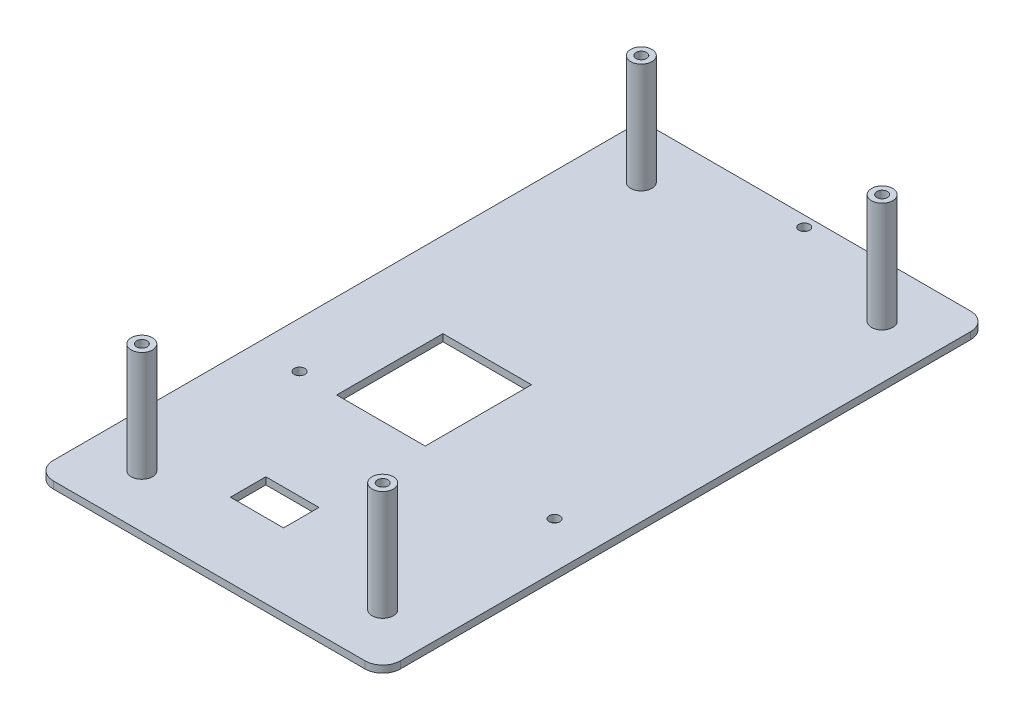
ISO-10303-21;
HEADER;
FILE_DESCRIPTION(('STEP AP214'),'2;1');
FILE_NAME('part.step','',(''),(''),'','','');
FILE_SCHEMA(('AUTOMOTIVE_DESIGN { 1 0 10303 214 1 1 1 1 }'));
ENDSEC;
DATA;
#1=APPLICATION_CONTEXT('core data for automotive mechanical design processes');
#2=APPLICATION_PROTOCOL_DEFINITION('international standard','automotive_design',2000,#1);
#3=PRODUCT_CONTEXT('',#1,'mechanical');
#4=PRODUCT('Part','Part','',(#3));
#5=PRODUCT_RELATED_PRODUCT_CATEGORY('part','',(#4));
#6=PRODUCT_DEFINITION_FORMATION('','',#4);
#7=PRODUCT_DEFINITION_CONTEXT('part definition',#1,'design');
#8=PRODUCT_DEFINITION('design','',#6,#7);
#9=PRODUCT_DEFINITION_SHAPE('','',#8);
#10=(LENGTH_UNIT() NAMED_UNIT(*) SI_UNIT(.MILLI.,.METRE.));
#11=(NAMED_UNIT(*) PLANE_ANGLE_UNIT() SI_UNIT($,.RADIAN.));
#12=(NAMED_UNIT(*) SI_UNIT($,.STERADIAN.) SOLID_ANGLE_UNIT());
#13=UNCERTAINTY_MEASURE_WITH_UNIT(LENGTH_MEASURE(1.E-05),#10,'distance_accuracy_value','');
#14=(GEOMETRIC_REPRESENTATION_CONTEXT(3) GLOBAL_UNCERTAINTY_ASSIGNED_CONTEXT((#13)) GLOBAL_UNIT_ASSIGNED_CONTEXT((#10,
#11,#12)) REPRESENTATION_CONTEXT('',''));
#15=CARTESIAN_POINT('',(0.,0.,0.));
#16=DIRECTION('',(0.,0.,1.));
#17=DIRECTION('',(1.,0.,0.));
#18=AXIS2_PLACEMENT_3D('',#15,#16,#17);
#19=CARTESIAN_POINT('',(0.,2.,64.5));
#20=DIRECTION('',(0.,0.,1.));
#21=DIRECTION('',(1.,0.,0.));
#22=AXIS2_PLACEMENT_3D('',#19,#20,#21);
#23=PLANE('',#22);
#24=DIRECTION('',(-1.,0.,0.));
#25=VECTOR('',#24,1.);
#26=CARTESIAN_POINT('',(0.,0.,64.5));
#27=LINE('',#26,#25);
#28=CARTESIAN_POINT('',(0.,0.,64.5));
#29=VERTEX_POINT('',#28);
#30=CARTESIAN_POINT('',(-15.,0.,64.5));
#31=VERTEX_POINT('',#30);
#32=EDGE_CURVE('E242',#29,#31,#27,.T.);
#33=ORIENTED_EDGE('',*,*,#32,.T.);
#34=DIRECTION('',(0.,-1.,0.));
#35=VECTOR('',#34,1.);
#36=CARTESIAN_POINT('',(-15.,2.,64.5));
#37=LINE('',#36,#35);
#38=CARTESIAN_POINT('',(-15.,2.,64.5));
#39=VERTEX_POINT('',#38);
#40=EDGE_CURVE('E267',#39,#31,#37,.T.);
#41=ORIENTED_EDGE('',*,*,#40,.F.);
#42=DIRECTION('',(-1.,0.,0.));
#43=VECTOR('',#42,1.);
#44=CARTESIAN_POINT('',(0.,2.,64.5));
#45=LINE('',#44,#43);
#46=CARTESIAN_POINT('',(0.,2.,64.5));
#47=VERTEX_POINT('',#46);
#48=EDGE_CURVE('E198',#47,#39,#45,.T.);
#49=ORIENTED_EDGE('',*,*,#48,.F.);
#50=DIRECTION('',(0.,-1.,0.));
#51=VECTOR('',#50,1.);
#52=CARTESIAN_POINT('',(0.,2.,64.5));
#53=LINE('',#52,#51);
#54=EDGE_CURVE('E170',#47,#29,#53,.T.);
#55=ORIENTED_EDGE('',*,*,#54,.T.);
#56=EDGE_LOOP('',(#33,#41,#49,#55));
#57=FACE_BOUND('',#56,.T.);
#58=ADVANCED_FACE('F41',(#57),#23,.F.);
#59=CARTESIAN_POINT('',(-15.,2.,0.));
#60=DIRECTION('',(-1.,0.,0.));
#61=DIRECTION('',(0.,0.,1.));
#62=AXIS2_PLACEMENT_3D('',#59,#60,#61);
#63=PLANE('',#62);
#64=DIRECTION('',(0.,0.,-1.));
#65=VECTOR('',#64,1.);
#66=CARTESIAN_POINT('',(-15.,0.,0.));
#67=LINE('',#66,#65);
#68=CARTESIAN_POINT('',(-15.,0.,54.5));
#69=VERTEX_POINT('',#68);
#70=EDGE_CURVE('E246',#31,#69,#67,.T.);
#71=ORIENTED_EDGE('',*,*,#70,.T.);
#72=DIRECTION('',(0.,-1.,0.));
#73=VECTOR('',#72,1.);
#74=CARTESIAN_POINT('',(-15.,2.,54.5));
#75=LINE('',#74,#73);
#76=CARTESIAN_POINT('',(-15.,2.,54.5));
#77=VERTEX_POINT('',#76);
#78=EDGE_CURVE('E264',#77,#69,#75,.T.);
#79=ORIENTED_EDGE('',*,*,#78,.F.);
#80=DIRECTION('',(0.,0.,-1.));
#81=VECTOR('',#80,1.);
#82=CARTESIAN_POINT('',(-15.,2.,0.));
#83=LINE('',#82,#81);
#84=EDGE_CURVE('E202',#39,#77,#83,.T.);
#85=ORIENTED_EDGE('',*,*,#84,.F.);
#86=ORIENTED_EDGE('',*,*,#40,.T.);
#87=EDGE_LOOP('',(#71,#79,#85,#86));
#88=FACE_BOUND('',#87,.T.);
#89=ADVANCED_FACE('F357',(#88),#63,.F.);
#90=CARTESIAN_POINT('',(0.,2.,54.5));
#91=DIRECTION('',(0.,0.,1.));
#92=DIRECTION('',(1.,0.,0.));
#93=AXIS2_PLACEMENT_3D('',#90,#91,#92);
#94=PLANE('',#93);
#95=DIRECTION('',(-1.,0.,0.));
#96=VECTOR('',#95,1.);
#97=CARTESIAN_POINT('',(0.,0.,54.5));
#98=LINE('',#97,#96);
#99=CARTESIAN_POINT('',(0.,0.,54.5));
#100=VERTEX_POINT('',#99);
#101=EDGE_CURVE('E250',#100,#69,#98,.T.);
#102=ORIENTED_EDGE('',*,*,#101,.F.);
#103=DIRECTION('',(0.,-1.,0.));
#104=VECTOR('',#103,1.);
#105=CARTESIAN_POINT('',(0.,2.,54.5));
#106=LINE('',#105,#104);
#107=CARTESIAN_POINT('',(0.,2.,54.5));
#108=VERTEX_POINT('',#107);
#109=EDGE_CURVE('E261',#108,#100,#106,.T.);
#110=ORIENTED_EDGE('',*,*,#109,.F.);
#111=DIRECTION('',(-1.,0.,0.));
#112=VECTOR('',#111,1.);
#113=CARTESIAN_POINT('',(0.,2.,54.5));
#114=LINE('',#113,#112);
#115=EDGE_CURVE('E205',#108,#77,#114,.T.);
#116=ORIENTED_EDGE('',*,*,#115,.T.);
#117=ORIENTED_EDGE('',*,*,#78,.T.);
#118=EDGE_LOOP('',(#102,#110,#116,#117));
#119=FACE_BOUND('',#118,.T.);
#120=ADVANCED_FACE('F363',(#119),#94,.T.);
#121=CARTESIAN_POINT('',(0.,2.,0.));
#122=DIRECTION('',(-1.,0.,0.));
#123=DIRECTION('',(0.,0.,1.));
#124=AXIS2_PLACEMENT_3D('',#121,#122,#123);
#125=PLANE('',#124);
#126=DIRECTION('',(0.,0.,-1.));
#127=VECTOR('',#126,1.);
#128=CARTESIAN_POINT('',(0.,0.,0.));
#129=LINE('',#128,#127);
#130=CARTESIAN_POINT('',(0.,0.,24.5));
#131=VERTEX_POINT('',#130);
#132=CARTESIAN_POINT('',(0.,0.,-5.50000000000001));
#133=VERTEX_POINT('',#132);
#134=EDGE_CURVE('E165',#131,#133,#129,.T.);
#135=ORIENTED_EDGE('',*,*,#134,.F.);
#136=DIRECTION('',(0.,-1.,0.));
#137=VECTOR('',#136,1.);
#138=CARTESIAN_POINT('',(0.,2.,24.5));
#139=LINE('',#138,#137);
#140=CARTESIAN_POINT('',(0.,2.,24.5));
#141=VERTEX_POINT('',#140);
#142=EDGE_CURVE('E158',#141,#131,#139,.T.);
#143=ORIENTED_EDGE('',*,*,#142,.F.);
#144=DIRECTION('',(0.,0.,-1.));
#145=VECTOR('',#144,1.);
#146=CARTESIAN_POINT('',(0.,2.,0.));
#147=LINE('',#146,#145);
#148=CARTESIAN_POINT('',(0.,2.,-5.50000000000001));
#149=VERTEX_POINT('',#148);
#150=EDGE_CURVE('E162',#141,#149,#147,.T.);
#151=ORIENTED_EDGE('',*,*,#150,.T.);
#152=DIRECTION('',(0.,-1.,0.));
#153=VECTOR('',#152,1.);
#154=CARTESIAN_POINT('',(0.,2.,-5.50000000000001));
#155=LINE('',#154,#153);
#156=EDGE_CURVE('E213',#149,#133,#155,.T.);
#157=ORIENTED_EDGE('',*,*,#156,.T.);
#158=EDGE_LOOP('',(#135,#143,#151,#157));
#159=FACE_BOUND('',#158,.T.);
#160=ADVANCED_FACE('F160',(#159),#125,.T.);
#161=CARTESIAN_POINT('',(0.,2.,24.5));
#162=DIRECTION('',(0.,0.,1.));
#163=DIRECTION('',(1.,0.,0.));
#164=AXIS2_PLACEMENT_3D('',#161,#162,#163);
#165=PLANE('',#164);
#166=DIRECTION('',(-1.,0.,0.));
#167=VECTOR('',#166,1.);
#168=CARTESIAN_POINT('',(0.,0.,24.5));
#169=LINE('',#168,#167);
#170=CARTESIAN_POINT('',(-25.,0.,24.5));
#171=VERTEX_POINT('',#170);
#172=EDGE_CURVE('E231',#131,#171,#169,.T.);
#173=ORIENTED_EDGE('',*,*,#172,.T.);
#174=DIRECTION('',(0.,-1.,0.));
#175=VECTOR('',#174,1.);
#176=CARTESIAN_POINT('',(-25.,2.,24.5));
#177=LINE('',#176,#175);
#178=CARTESIAN_POINT('',(-25.,2.,24.5));
#179=VERTEX_POINT('',#178);
#180=EDGE_CURVE('E171',#179,#171,#177,.T.);
#181=ORIENTED_EDGE('',*,*,#180,.F.);
#182=DIRECTION('',(-1.,0.,0.));
#183=VECTOR('',#182,1.);
#184=CARTESIAN_POINT('',(0.,2.,24.5));
#185=LINE('',#184,#183);
#186=EDGE_CURVE('E174',#141,#179,#185,.T.);
#187=ORIENTED_EDGE('',*,*,#186,.F.);
#188=ORIENTED_EDGE('',*,*,#142,.T.);
#189=EDGE_LOOP('',(#173,#181,#187,#188));
#190=FACE_BOUND('',#189,.T.);
#191=ADVANCED_FACE('F175',(#190),#165,.F.);
#192=CARTESIAN_POINT('',(-25.,2.,0.));
#193=DIRECTION('',(1.,0.,0.));
#194=DIRECTION('',(0.,0.,-1.));
#195=AXIS2_PLACEMENT_3D('',#192,#193,#194);
#196=PLANE('',#195);
#197=DIRECTION('',(0.,0.,1.));
#198=VECTOR('',#197,1.);
#199=CARTESIAN_POINT('',(-25.,0.,0.));
#200=LINE('',#199,#198);
#201=CARTESIAN_POINT('',(-25.,0.,-5.5));
#202=VERTEX_POINT('',#201);
#203=EDGE_CURVE('E234',#202,#171,#200,.T.);
#204=ORIENTED_EDGE('',*,*,#203,.F.);
#205=DIRECTION('',(0.,-1.,0.));
#206=VECTOR('',#205,1.);
#207=CARTESIAN_POINT('',(-25.,2.,-5.5));
#208=LINE('',#207,#206);
#209=CARTESIAN_POINT('',(-25.,2.,-5.5));
#210=VERTEX_POINT('',#209);
#211=EDGE_CURVE('E274',#210,#202,#208,.T.);
#212=ORIENTED_EDGE('',*,*,#211,.F.);
#213=DIRECTION('',(0.,0.,1.));
#214=VECTOR('',#213,1.);
#215=CARTESIAN_POINT('',(-25.,2.,0.));
#216=LINE('',#215,#214);
#217=EDGE_CURVE('E180',#210,#179,#216,.T.);
#218=ORIENTED_EDGE('',*,*,#217,.T.);
#219=ORIENTED_EDGE('',*,*,#180,.T.);
#220=EDGE_LOOP('',(#204,#212,#218,#219));
#221=FACE_BOUND('',#220,.T.);
#222=ADVANCED_FACE('F374',(#221),#196,.T.);
#223=CARTESIAN_POINT('',(49.,2.,0.));
#224=DIRECTION('',(1.,0.,0.));
#225=DIRECTION('',(0.,0.,-1.));
#226=AXIS2_PLACEMENT_3D('',#223,#224,#225);
#227=PLANE('',#226);
#228=DIRECTION('',(0.,0.,1.));
#229=VECTOR('',#228,1.);
#230=CARTESIAN_POINT('',(49.,0.,0.));
#231=LINE('',#230,#229);
#232=CARTESIAN_POINT('',(49.,0.,-80.5));
#233=VERTEX_POINT('',#232);
#234=CARTESIAN_POINT('',(49.,0.,80.5));
#235=VERTEX_POINT('',#234);
#236=EDGE_CURVE('E214',#233,#235,#231,.T.);
#237=ORIENTED_EDGE('',*,*,#236,.F.);
#238=DIRECTION('',(0.,-1.,0.));
#239=VECTOR('',#238,1.);
#240=CARTESIAN_POINT('',(49.,2.,-80.5));
#241=LINE('',#240,#239);
#242=CARTESIAN_POINT('',(49.,2.,-80.5));
#243=VERTEX_POINT('',#242);
#244=EDGE_CURVE('E301',#233,#243,#241,.F.);
#245=ORIENTED_EDGE('',*,*,#244,.T.);
#246=DIRECTION('',(0.,0.,1.));
#247=VECTOR('',#246,1.);
#248=CARTESIAN_POINT('',(49.,2.,0.));
#249=LINE('',#248,#247);
#250=CARTESIAN_POINT('',(49.,2.,80.5));
#251=VERTEX_POINT('',#250);
#252=EDGE_CURVE('E258',#243,#251,#249,.T.);
#253=ORIENTED_EDGE('',*,*,#252,.T.);
#254=DIRECTION('',(0.,-1.,0.));
#255=VECTOR('',#254,1.);
#256=CARTESIAN_POINT('',(49.,0.,80.5));
#257=LINE('',#256,#255);
#258=EDGE_CURVE('E297',#251,#235,#257,.T.);
#259=ORIENTED_EDGE('',*,*,#258,.T.);
#260=EDGE_LOOP('',(#237,#245,#253,#259));
#261=FACE_BOUND('',#260,.T.);
#262=ADVANCED_FACE('F377',(#261),#227,.T.);
#263=CARTESIAN_POINT('',(0.,2.,-85.5));
#264=DIRECTION('',(0.,0.,-1.));
#265=DIRECTION('',(-1.,0.,0.));
#266=AXIS2_PLACEMENT_3D('',#263,#264,#265);
#267=PLANE('',#266);
#268=DIRECTION('',(1.,0.,0.));
#269=VECTOR('',#268,1.);
#270=CARTESIAN_POINT('',(0.,2.,-85.5));
#271=LINE('',#270,#269);
#272=CARTESIAN_POINT('',(-44.,2.,-85.5));
#273=VERTEX_POINT('',#272);
#274=CARTESIAN_POINT('',(44.,2.,-85.5));
#275=VERTEX_POINT('',#274);
#276=EDGE_CURVE('E424',#273,#275,#271,.T.);
#277=ORIENTED_EDGE('',*,*,#276,.T.);
#278=DIRECTION('',(0.,-1.,0.));
#279=VECTOR('',#278,1.);
#280=CARTESIAN_POINT('',(44.,2.,-85.5));
#281=LINE('',#280,#279);
#282=CARTESIAN_POINT('',(44.,0.,-85.5));
#283=VERTEX_POINT('',#282);
#284=EDGE_CURVE('E281',#275,#283,#281,.T.);
#285=ORIENTED_EDGE('',*,*,#284,.T.);
#286=DIRECTION('',(1.,0.,0.));
#287=VECTOR('',#286,1.);
#288=CARTESIAN_POINT('',(0.,0.,-85.5));
#289=LINE('',#288,#287);
#290=CARTESIAN_POINT('',(-44.,0.,-85.5));
#291=VERTEX_POINT('',#290);
#292=EDGE_CURVE('E218',#291,#283,#289,.T.);
#293=ORIENTED_EDGE('',*,*,#292,.F.);
#294=DIRECTION('',(0.,-1.,0.));
#295=VECTOR('',#294,1.);
#296=CARTESIAN_POINT('',(-44.,2.,-85.5));
#297=LINE('',#296,#295);
#298=EDGE_CURVE('E271',#291,#273,#297,.F.);
#299=ORIENTED_EDGE('',*,*,#298,.T.);
#300=EDGE_LOOP('',(#277,#285,#293,#299));
#301=FACE_BOUND('',#300,.T.);
#302=ADVANCED_FACE('F388',(#301),#267,.T.);
#303=CARTESIAN_POINT('',(-49.,2.,0.));
#304=DIRECTION('',(1.,0.,0.));
#305=DIRECTION('',(0.,0.,-1.));
#306=AXIS2_PLACEMENT_3D('',#303,#304,#305);
#307=PLANE('',#306);
#308=DIRECTION('',(0.,0.,1.));
#309=VECTOR('',#308,1.);
#310=CARTESIAN_POINT('',(-49.,2.,0.));
#311=LINE('',#310,#309);
#312=CARTESIAN_POINT('',(-49.,2.,-80.5));
#313=VERTEX_POINT('',#312);
#314=CARTESIAN_POINT('',(-49.,2.,80.5));
#315=VERTEX_POINT('',#314);
#316=EDGE_CURVE('E190',#313,#315,#311,.T.);
#317=ORIENTED_EDGE('',*,*,#316,.F.);
#318=DIRECTION('',(0.,-1.,0.));
#319=VECTOR('',#318,1.);
#320=CARTESIAN_POINT('',(-49.,0.,-80.5));
#321=LINE('',#320,#319);
#322=CARTESIAN_POINT('',(-49.,0.,-80.5));
#323=VERTEX_POINT('',#322);
#324=EDGE_CURVE('E318',#313,#323,#321,.T.);
#325=ORIENTED_EDGE('',*,*,#324,.T.);
#326=DIRECTION('',(0.,0.,1.));
#327=VECTOR('',#326,1.);
#328=CARTESIAN_POINT('',(-49.,0.,0.));
#329=LINE('',#328,#327);
#330=CARTESIAN_POINT('',(-49.,0.,80.5));
#331=VERTEX_POINT('',#330);
#332=EDGE_CURVE('E222',#323,#331,#329,.T.);
#333=ORIENTED_EDGE('',*,*,#332,.T.);
#334=DIRECTION('',(0.,-1.,0.));
#335=VECTOR('',#334,1.);
#336=CARTESIAN_POINT('',(-49.,2.,80.5));
#337=LINE('',#336,#335);
#338=EDGE_CURVE('E315',#331,#315,#337,.F.);
#339=ORIENTED_EDGE('',*,*,#338,.T.);
#340=EDGE_LOOP('',(#317,#325,#333,#339));
#341=FACE_BOUND('',#340,.T.);
#342=ADVANCED_FACE('F372',(#341),#307,.F.);
#343=CARTESIAN_POINT('',(0.,2.,-5.50000000000001));
#344=DIRECTION('',(0.,0.,1.));
#345=DIRECTION('',(1.,0.,0.));
#346=AXIS2_PLACEMENT_3D('',#343,#344,#345);
#347=PLANE('',#346);
#348=DIRECTION('',(-1.,0.,0.));
#349=VECTOR('',#348,1.);
#350=CARTESIAN_POINT('',(0.,0.,-5.50000000000001));
#351=LINE('',#350,#349);
#352=EDGE_CURVE('E238',#133,#202,#351,.T.);
#353=ORIENTED_EDGE('',*,*,#352,.F.);
#354=ORIENTED_EDGE('',*,*,#156,.F.);
#355=DIRECTION('',(-1.,0.,0.));
#356=VECTOR('',#355,1.);
#357=CARTESIAN_POINT('',(0.,2.,-5.50000000000001));
#358=LINE('',#357,#356);
#359=EDGE_CURVE('E185',#149,#210,#358,.T.);
#360=ORIENTED_EDGE('',*,*,#359,.T.);
#361=ORIENTED_EDGE('',*,*,#211,.T.);
#362=EDGE_LOOP('',(#353,#354,#360,#361));
#363=FACE_BOUND('',#362,.T.);
#364=ADVANCED_FACE('F368',(#363),#347,.T.);
#365=CARTESIAN_POINT('',(0.,2.,85.5));
#366=DIRECTION('',(0.,0.,-1.));
#367=DIRECTION('',(-1.,0.,0.));
#368=AXIS2_PLACEMENT_3D('',#365,#366,#367);
#369=PLANE('',#368);
#370=DIRECTION('',(1.,0.,0.));
#371=VECTOR('',#370,1.);
#372=CARTESIAN_POINT('',(0.,2.,85.5));
#373=LINE('',#372,#371);
#374=CARTESIAN_POINT('',(-44.,2.,85.5));
#375=VERTEX_POINT('',#374);
#376=CARTESIAN_POINT('',(44.,2.,85.5));
#377=VERTEX_POINT('',#376);
#378=EDGE_CURVE('E187',#375,#377,#373,.T.);
#379=ORIENTED_EDGE('',*,*,#378,.F.);
#380=DIRECTION('',(0.,-1.,0.));
#381=VECTOR('',#380,1.);
#382=CARTESIAN_POINT('',(-44.,2.,85.5));
#383=LINE('',#382,#381);
#384=CARTESIAN_POINT('',(-44.,0.,85.5));
#385=VERTEX_POINT('',#384);
#386=EDGE_CURVE('E11',#375,#385,#383,.T.);
#387=ORIENTED_EDGE('',*,*,#386,.T.);
#388=DIRECTION('',(1.,0.,0.));
#389=VECTOR('',#388,1.);
#390=CARTESIAN_POINT('',(0.,0.,85.5));
#391=LINE('',#390,#389);
#392=CARTESIAN_POINT('',(44.,0.,85.5));
#393=VERTEX_POINT('',#392);
#394=EDGE_CURVE('E226',#385,#393,#391,.T.);
#395=ORIENTED_EDGE('',*,*,#394,.T.);
#396=DIRECTION('',(0.,-1.,0.));
#397=VECTOR('',#396,1.);
#398=CARTESIAN_POINT('',(44.,2.,85.5));
#399=LINE('',#398,#397);
#400=EDGE_CURVE('E51',#393,#377,#399,.F.);
#401=ORIENTED_EDGE('',*,*,#400,.T.);
#402=EDGE_LOOP('',(#379,#387,#395,#401));
#403=FACE_BOUND('',#402,.T.);
#404=ADVANCED_FACE('F371',(#403),#369,.F.);
#405=CARTESIAN_POINT('',(0.,2.,0.));
#406=DIRECTION('',(-1.,0.,0.));
#407=DIRECTION('',(0.,0.,1.));
#408=AXIS2_PLACEMENT_3D('',#405,#406,#407);
#409=PLANE('',#408);
#410=DIRECTION('',(0.,0.,-1.));
#411=VECTOR('',#410,1.);
#412=CARTESIAN_POINT('',(0.,0.,0.));
#413=LINE('',#412,#411);
#414=EDGE_CURVE('E254',#29,#100,#413,.T.);
#415=ORIENTED_EDGE('',*,*,#414,.F.);
#416=ORIENTED_EDGE('',*,*,#54,.F.);
#417=DIRECTION('',(0.,0.,-1.));
#418=VECTOR('',#417,1.);
#419=CARTESIAN_POINT('',(0.,2.,0.));
#420=LINE('',#419,#418);
#421=EDGE_CURVE('E209',#47,#108,#420,.T.);
#422=ORIENTED_EDGE('',*,*,#421,.T.);
#423=ORIENTED_EDGE('',*,*,#109,.T.);
#424=EDGE_LOOP('',(#415,#416,#422,#423));
#425=FACE_BOUND('',#424,.T.);
#426=ADVANCED_FACE('F385',(#425),#409,.T.);
#427=CARTESIAN_POINT('',(0.,2.,0.));
#428=DIRECTION('',(0.,1.,0.));
#429=DIRECTION('',(0.,0.,1.));
#430=AXIS2_PLACEMENT_3D('',#427,#428,#429);
#431=PLANE('',#430);
#432=CARTESIAN_POINT('',(-34.,2.,70.5));
#433=DIRECTION('',(0.,1.,0.));
#434=DIRECTION('',(0.,0.,-1.));
#435=AXIS2_PLACEMENT_3D('',#432,#433,#434);
#436=CIRCLE('',#435,3.);
#437=CARTESIAN_POINT('',(-34.,2.,67.5));
#438=VERTEX_POINT('',#437);
#439=EDGE_CURVE('E711',#438,#438,#436,.T.);
#440=ORIENTED_EDGE('',*,*,#439,.F.);
#441=EDGE_LOOP('',(#440));
#442=FACE_BOUND('',#441,.T.);
#443=CARTESIAN_POINT('',(34.,2.,70.5));
#444=DIRECTION('',(0.,1.,0.));
#445=DIRECTION('',(0.,0.,1.));
#446=AXIS2_PLACEMENT_3D('',#443,#444,#445);
#447=CIRCLE('',#446,3.);
#448=CARTESIAN_POINT('',(34.,2.,73.5));
#449=VERTEX_POINT('',#448);
#450=EDGE_CURVE('E728',#449,#449,#447,.T.);
#451=ORIENTED_EDGE('',*,*,#450,.F.);
#452=EDGE_LOOP('',(#451));
#453=FACE_BOUND('',#452,.T.);
#454=CARTESIAN_POINT('',(34.,2.,-70.5));
#455=DIRECTION('',(0.,1.,0.));
#456=DIRECTION('',(0.,0.,-1.));
#457=AXIS2_PLACEMENT_3D('',#454,#455,#456);
#458=CIRCLE('',#457,3.);
#459=CARTESIAN_POINT('',(34.,2.,-73.5));
#460=VERTEX_POINT('',#459);
#461=EDGE_CURVE('E734',#460,#460,#458,.T.);
#462=ORIENTED_EDGE('',*,*,#461,.F.);
#463=EDGE_LOOP('',(#462));
#464=FACE_BOUND('',#463,.T.);
#465=CARTESIAN_POINT('',(-34.,2.,-70.5));
#466=DIRECTION('',(0.,1.,0.));
#467=DIRECTION('',(0.,0.,1.));
#468=AXIS2_PLACEMENT_3D('',#465,#466,#467);
#469=CIRCLE('',#468,3.);
#470=CARTESIAN_POINT('',(-34.,2.,-67.5));
#471=VERTEX_POINT('',#470);
#472=EDGE_CURVE('E742',#471,#471,#469,.T.);
#473=ORIENTED_EDGE('',*,*,#472,.F.);
#474=EDGE_LOOP('',(#473));
#475=FACE_BOUND('',#474,.T.);
#476=CARTESIAN_POINT('',(36.,2.,24.));
#477=DIRECTION('',(0.,1.,0.));
#478=DIRECTION('',(0.,0.,1.));
#479=AXIS2_PLACEMENT_3D('',#476,#477,#478);
#480=CIRCLE('',#479,1.5);
#481=CARTESIAN_POINT('',(36.,2.,25.5));
#482=VERTEX_POINT('',#481);
#483=EDGE_CURVE('E328',#482,#482,#480,.T.);
#484=ORIENTED_EDGE('',*,*,#483,.F.);
#485=EDGE_LOOP('',(#484));
#486=FACE_BOUND('',#485,.T.);
#487=CARTESIAN_POINT('',(-36.,2.,24.));
#488=DIRECTION('',(0.,1.,0.));
#489=DIRECTION('',(0.,0.,1.));
#490=AXIS2_PLACEMENT_3D('',#487,#488,#489);
#491=CIRCLE('',#490,1.5);
#492=CARTESIAN_POINT('',(-36.,2.,25.5));
#493=VERTEX_POINT('',#492);
#494=EDGE_CURVE('E754',#493,#493,#491,.T.);
#495=ORIENTED_EDGE('',*,*,#494,.F.);
#496=EDGE_LOOP('',(#495));
#497=FACE_BOUND('',#496,.T.);
#498=CARTESIAN_POINT('',(0.,2.,-82.5));
#499=DIRECTION('',(0.,1.,0.));
#500=DIRECTION('',(0.,0.,1.));
#501=AXIS2_PLACEMENT_3D('',#498,#499,#500);
#502=CIRCLE('',#501,1.5);
#503=CARTESIAN_POINT('',(0.,2.,-81.));
#504=VERTEX_POINT('',#503);
#505=EDGE_CURVE('E430',#504,#504,#502,.T.);
#506=ORIENTED_EDGE('',*,*,#505,.F.);
#507=EDGE_LOOP('',(#506));
#508=FACE_BOUND('',#507,.T.);
#509=ORIENTED_EDGE('',*,*,#252,.F.);
#510=CARTESIAN_POINT('',(44.,2.,-80.5));
#511=DIRECTION('',(0.,1.,0.));
#512=DIRECTION('',(0.,0.,1.));
#513=AXIS2_PLACEMENT_3D('',#510,#511,#512);
#514=CIRCLE('',#513,5.);
#515=EDGE_CURVE('E312',#243,#275,#514,.T.);
#516=ORIENTED_EDGE('',*,*,#515,.T.);
#517=ORIENTED_EDGE('',*,*,#276,.F.);
#518=CARTESIAN_POINT('',(-44.,2.,-80.5));
#519=DIRECTION('',(0.,1.,0.));
#520=DIRECTION('',(0.,0.,1.));
#521=AXIS2_PLACEMENT_3D('',#518,#519,#520);
#522=CIRCLE('',#521,5.);
#523=EDGE_CURVE('E309',#273,#313,#522,.T.);
#524=ORIENTED_EDGE('',*,*,#523,.T.);
#525=ORIENTED_EDGE('',*,*,#316,.T.);
#526=CARTESIAN_POINT('',(-44.,2.,80.5));
#527=DIRECTION('',(0.,1.,0.));
#528=DIRECTION('',(0.,0.,1.));
#529=AXIS2_PLACEMENT_3D('',#526,#527,#528);
#530=CIRCLE('',#529,5.);
#531=EDGE_CURVE('E65',#315,#375,#530,.T.);
#532=ORIENTED_EDGE('',*,*,#531,.T.);
#533=ORIENTED_EDGE('',*,*,#378,.T.);
#534=CARTESIAN_POINT('',(44.,2.,80.5));
#535=DIRECTION('',(0.,1.,0.));
#536=DIRECTION('',(0.,0.,1.));
#537=AXIS2_PLACEMENT_3D('',#534,#535,#536);
#538=CIRCLE('',#537,5.);
#539=EDGE_CURVE('E304',#377,#251,#538,.T.);
#540=ORIENTED_EDGE('',*,*,#539,.T.);
#541=EDGE_LOOP('',(#509,#516,#517,#524,#525,#532,#533,#540));
#542=FACE_BOUND('',#541,.T.);
#543=ORIENTED_EDGE('',*,*,#150,.F.);
#544=ORIENTED_EDGE('',*,*,#186,.T.);
#545=ORIENTED_EDGE('',*,*,#217,.F.);
#546=ORIENTED_EDGE('',*,*,#359,.F.);
#547=EDGE_LOOP('',(#543,#544,#545,#546));
#548=FACE_BOUND('',#547,.T.);
#549=ORIENTED_EDGE('',*,*,#48,.T.);
#550=ORIENTED_EDGE('',*,*,#84,.T.);
#551=ORIENTED_EDGE('',*,*,#115,.F.);
#552=ORIENTED_EDGE('',*,*,#421,.F.);
#553=EDGE_LOOP('',(#549,#550,#551,#552));
#554=FACE_BOUND('',#553,.T.);
#555=ADVANCED_FACE('F182',(#442,#453,#464,#475,#486,#497,#508,#542,#548,#554),#431,.T.);
#556=CARTESIAN_POINT('',(0.,0.,0.));
#557=DIRECTION('',(0.,1.,0.));
#558=DIRECTION('',(0.,0.,1.));
#559=AXIS2_PLACEMENT_3D('',#556,#557,#558);
#560=PLANE('',#559);
#561=CARTESIAN_POINT('',(36.,0.,24.));
#562=DIRECTION('',(0.,1.,0.));
#563=DIRECTION('',(0.,0.,1.));
#564=AXIS2_PLACEMENT_3D('',#561,#562,#563);
#565=CIRCLE('',#564,1.5);
#566=CARTESIAN_POINT('',(36.,0.,25.5));
#567=VERTEX_POINT('',#566);
#568=EDGE_CURVE('E45',#567,#567,#565,.T.);
#569=ORIENTED_EDGE('',*,*,#568,.T.);
#570=EDGE_LOOP('',(#569));
#571=FACE_BOUND('',#570,.T.);
#572=CARTESIAN_POINT('',(-36.,0.,24.));
#573=DIRECTION('',(0.,1.,0.));
#574=DIRECTION('',(0.,0.,1.));
#575=AXIS2_PLACEMENT_3D('',#572,#573,#574);
#576=CIRCLE('',#575,1.5);
#577=CARTESIAN_POINT('',(-36.,0.,25.5));
#578=VERTEX_POINT('',#577);
#579=EDGE_CURVE('E327',#578,#578,#576,.T.);
#580=ORIENTED_EDGE('',*,*,#579,.T.);
#581=EDGE_LOOP('',(#580));
#582=FACE_BOUND('',#581,.T.);
#583=CARTESIAN_POINT('',(0.,0.,-82.5));
#584=DIRECTION('',(0.,1.,0.));
#585=DIRECTION('',(0.,0.,1.));
#586=AXIS2_PLACEMENT_3D('',#583,#584,#585);
#587=CIRCLE('',#586,1.5);
#588=CARTESIAN_POINT('',(0.,0.,-81.));
#589=VERTEX_POINT('',#588);
#590=EDGE_CURVE('E324',#589,#589,#587,.T.);
#591=ORIENTED_EDGE('',*,*,#590,.T.);
#592=EDGE_LOOP('',(#591));
#593=FACE_BOUND('',#592,.T.);
#594=ORIENTED_EDGE('',*,*,#292,.T.);
#595=CARTESIAN_POINT('',(44.,0.,-80.5));
#596=DIRECTION('',(0.,1.,0.));
#597=DIRECTION('',(0.,0.,1.));
#598=AXIS2_PLACEMENT_3D('',#595,#596,#597);
#599=CIRCLE('',#598,5.);
#600=EDGE_CURVE('E294',#283,#233,#599,.F.);
#601=ORIENTED_EDGE('',*,*,#600,.T.);
#602=ORIENTED_EDGE('',*,*,#236,.T.);
#603=CARTESIAN_POINT('',(44.,0.,80.5));
#604=DIRECTION('',(0.,1.,0.));
#605=DIRECTION('',(0.,0.,1.));
#606=AXIS2_PLACEMENT_3D('',#603,#604,#605);
#607=CIRCLE('',#606,5.);
#608=EDGE_CURVE('E285',#235,#393,#607,.F.);
#609=ORIENTED_EDGE('',*,*,#608,.T.);
#610=ORIENTED_EDGE('',*,*,#394,.F.);
#611=CARTESIAN_POINT('',(-44.,0.,80.5));
#612=DIRECTION('',(0.,1.,0.));
#613=DIRECTION('',(0.,0.,1.));
#614=AXIS2_PLACEMENT_3D('',#611,#612,#613);
#615=CIRCLE('',#614,5.);
#616=EDGE_CURVE('E288',#385,#331,#615,.F.);
#617=ORIENTED_EDGE('',*,*,#616,.T.);
#618=ORIENTED_EDGE('',*,*,#332,.F.);
#619=CARTESIAN_POINT('',(-44.,0.,-80.5));
#620=DIRECTION('',(0.,1.,0.));
#621=DIRECTION('',(0.,0.,1.));
#622=AXIS2_PLACEMENT_3D('',#619,#620,#621);
#623=CIRCLE('',#622,5.);
#624=EDGE_CURVE('E291',#323,#291,#623,.F.);
#625=ORIENTED_EDGE('',*,*,#624,.T.);
#626=EDGE_LOOP('',(#594,#601,#602,#609,#610,#617,#618,#625));
#627=FACE_BOUND('',#626,.T.);
#628=ORIENTED_EDGE('',*,*,#134,.T.);
#629=ORIENTED_EDGE('',*,*,#352,.T.);
#630=ORIENTED_EDGE('',*,*,#203,.T.);
#631=ORIENTED_EDGE('',*,*,#172,.F.);
#632=EDGE_LOOP('',(#628,#629,#630,#631));
#633=FACE_BOUND('',#632,.T.);
#634=ORIENTED_EDGE('',*,*,#32,.F.);
#635=ORIENTED_EDGE('',*,*,#414,.T.);
#636=ORIENTED_EDGE('',*,*,#101,.T.);
#637=ORIENTED_EDGE('',*,*,#70,.F.);
#638=EDGE_LOOP('',(#634,#635,#636,#637));
#639=FACE_BOUND('',#638,.T.);
#640=ADVANCED_FACE('F337',(#571,#582,#593,#627,#633,#639),#560,.F.);
#641=CARTESIAN_POINT('',(44.,2.,-80.5));
#642=DIRECTION('',(0.,-1.,0.));
#643=DIRECTION('',(0.,0.,-1.));
#644=AXIS2_PLACEMENT_3D('',#641,#642,#643);
#645=CYLINDRICAL_SURFACE('',#644,5.);
#646=ORIENTED_EDGE('',*,*,#515,.F.);
#647=ORIENTED_EDGE('',*,*,#244,.F.);
#648=ORIENTED_EDGE('',*,*,#600,.F.);
#649=ORIENTED_EDGE('',*,*,#284,.F.);
#650=EDGE_LOOP('',(#646,#647,#648,#649));
#651=FACE_BOUND('',#650,.T.);
#652=ADVANCED_FACE('F396',(#651),#645,.T.);
#653=CARTESIAN_POINT('',(-44.,2.,-80.5));
#654=DIRECTION('',(0.,1.,0.));
#655=DIRECTION('',(0.,0.,1.));
#656=AXIS2_PLACEMENT_3D('',#653,#654,#655);
#657=CYLINDRICAL_SURFACE('',#656,5.);
#658=ORIENTED_EDGE('',*,*,#523,.F.);
#659=ORIENTED_EDGE('',*,*,#298,.F.);
#660=ORIENTED_EDGE('',*,*,#624,.F.);
#661=ORIENTED_EDGE('',*,*,#324,.F.);
#662=EDGE_LOOP('',(#658,#659,#660,#661));
#663=FACE_BOUND('',#662,.T.);
#664=ADVANCED_FACE('F399',(#663),#657,.T.);
#665=CARTESIAN_POINT('',(-44.,2.,80.5));
#666=DIRECTION('',(0.,-1.,0.));
#667=DIRECTION('',(0.,0.,-1.));
#668=AXIS2_PLACEMENT_3D('',#665,#666,#667);
#669=CYLINDRICAL_SURFACE('',#668,5.);
#670=ORIENTED_EDGE('',*,*,#531,.F.);
#671=ORIENTED_EDGE('',*,*,#338,.F.);
#672=ORIENTED_EDGE('',*,*,#616,.F.);
#673=ORIENTED_EDGE('',*,*,#386,.F.);
#674=EDGE_LOOP('',(#670,#671,#672,#673));
#675=FACE_BOUND('',#674,.T.);
#676=ADVANCED_FACE('F402',(#675),#669,.T.);
#677=CARTESIAN_POINT('',(44.,2.,80.5));
#678=DIRECTION('',(0.,1.,0.));
#679=DIRECTION('',(0.,0.,1.));
#680=AXIS2_PLACEMENT_3D('',#677,#678,#679);
#681=CYLINDRICAL_SURFACE('',#680,5.);
#682=ORIENTED_EDGE('',*,*,#539,.F.);
#683=ORIENTED_EDGE('',*,*,#400,.F.);
#684=ORIENTED_EDGE('',*,*,#608,.F.);
#685=ORIENTED_EDGE('',*,*,#258,.F.);
#686=EDGE_LOOP('',(#682,#683,#684,#685));
#687=FACE_BOUND('',#686,.T.);
#688=ADVANCED_FACE('F43',(#687),#681,.T.);
#689=CARTESIAN_POINT('',(0.,-8.,-82.5));
#690=DIRECTION('',(0.,1.,0.));
#691=DIRECTION('',(0.,0.,1.));
#692=AXIS2_PLACEMENT_3D('',#689,#690,#691);
#693=CYLINDRICAL_SURFACE('',#692,1.5);
#694=ORIENTED_EDGE('',*,*,#505,.T.);
#695=EDGE_LOOP('',(#694));
#696=FACE_BOUND('',#695,.T.);
#697=ORIENTED_EDGE('',*,*,#590,.F.);
#698=EDGE_LOOP('',(#697));
#699=FACE_BOUND('',#698,.T.);
#700=ADVANCED_FACE('F352',(#696,#699),#693,.F.);
#701=CARTESIAN_POINT('',(-36.,-8.,24.));
#702=DIRECTION('',(0.,1.,0.));
#703=DIRECTION('',(0.,0.,1.));
#704=AXIS2_PLACEMENT_3D('',#701,#702,#703);
#705=CYLINDRICAL_SURFACE('',#704,1.5);
#706=ORIENTED_EDGE('',*,*,#494,.T.);
#707=EDGE_LOOP('',(#706));
#708=FACE_BOUND('',#707,.T.);
#709=ORIENTED_EDGE('',*,*,#579,.F.);
#710=EDGE_LOOP('',(#709));
#711=FACE_BOUND('',#710,.T.);
#712=ADVANCED_FACE('F342',(#708,#711),#705,.F.);
#713=CARTESIAN_POINT('',(36.,-8.,24.));
#714=DIRECTION('',(0.,1.,0.));
#715=DIRECTION('',(0.,0.,1.));
#716=AXIS2_PLACEMENT_3D('',#713,#714,#715);
#717=CYLINDRICAL_SURFACE('',#716,1.5);
#718=ORIENTED_EDGE('',*,*,#483,.T.);
#719=EDGE_LOOP('',(#718));
#720=FACE_BOUND('',#719,.T.);
#721=ORIENTED_EDGE('',*,*,#568,.F.);
#722=EDGE_LOOP('',(#721));
#723=FACE_BOUND('',#722,.T.);
#724=ADVANCED_FACE('F339',(#720,#723),#717,.F.);
#725=CARTESIAN_POINT('',(-34.,33.,-70.5));
#726=DIRECTION('',(0.,-1.,0.));
#727=DIRECTION('',(0.,0.,-1.));
#728=AXIS2_PLACEMENT_3D('',#725,#726,#727);
#729=CYLINDRICAL_SURFACE('',#728,3.);
#730=CARTESIAN_POINT('',(-34.,33.,-70.5));
#731=DIRECTION('',(0.,1.,0.));
#732=DIRECTION('',(0.,0.,1.));
#733=AXIS2_PLACEMENT_3D('',#730,#731,#732);
#734=CIRCLE('',#733,3.);
#735=CARTESIAN_POINT('',(-34.,33.,-67.5));
#736=VERTEX_POINT('',#735);
#737=EDGE_CURVE('E746',#736,#736,#734,.T.);
#738=ORIENTED_EDGE('',*,*,#737,.F.);
#739=EDGE_LOOP('',(#738));
#740=FACE_BOUND('',#739,.T.);
#741=ORIENTED_EDGE('',*,*,#472,.T.);
#742=EDGE_LOOP('',(#741));
#743=FACE_BOUND('',#742,.T.);
#744=ADVANCED_FACE('F341',(#740,#743),#729,.T.);
#745=CARTESIAN_POINT('',(-34.,33.,-70.5));
#746=DIRECTION('',(0.,1.,0.));
#747=DIRECTION('',(0.,0.,1.));
#748=AXIS2_PLACEMENT_3D('',#745,#746,#747);
#749=PLANE('',#748);
#750=CARTESIAN_POINT('',(-34.,33.,-70.5));
#751=DIRECTION('',(0.,1.,0.));
#752=DIRECTION('',(0.,0.,1.));
#753=AXIS2_PLACEMENT_3D('',#750,#751,#752);
#754=CIRCLE('',#753,1.5);
#755=CARTESIAN_POINT('',(-34.,33.,-69.));
#756=VERTEX_POINT('',#755);
#757=EDGE_CURVE('E712',#756,#756,#754,.T.);
#758=ORIENTED_EDGE('',*,*,#757,.F.);
#759=EDGE_LOOP('',(#758));
#760=FACE_BOUND('',#759,.T.);
#761=ORIENTED_EDGE('',*,*,#737,.T.);
#762=EDGE_LOOP('',(#761));
#763=FACE_BOUND('',#762,.T.);
#764=ADVANCED_FACE('F349',(#760,#763),#749,.T.);
#765=CARTESIAN_POINT('',(34.,33.,-70.5));
#766=DIRECTION('',(0.,-1.,0.));
#767=DIRECTION('',(0.,0.,-1.));
#768=AXIS2_PLACEMENT_3D('',#765,#766,#767);
#769=CYLINDRICAL_SURFACE('',#768,3.);
#770=CARTESIAN_POINT('',(34.,33.,-70.5));
#771=DIRECTION('',(0.,1.,0.));
#772=DIRECTION('',(0.,0.,-1.));
#773=AXIS2_PLACEMENT_3D('',#770,#771,#772);
#774=CIRCLE('',#773,3.);
#775=CARTESIAN_POINT('',(34.,33.,-73.5));
#776=VERTEX_POINT('',#775);
#777=EDGE_CURVE('E738',#776,#776,#774,.T.);
#778=ORIENTED_EDGE('',*,*,#777,.F.);
#779=EDGE_LOOP('',(#778));
#780=FACE_BOUND('',#779,.T.);
#781=ORIENTED_EDGE('',*,*,#461,.T.);
#782=EDGE_LOOP('',(#781));
#783=FACE_BOUND('',#782,.T.);
#784=ADVANCED_FACE('F564',(#780,#783),#769,.T.);
#785=CARTESIAN_POINT('',(34.,33.,-70.5));
#786=DIRECTION('',(0.,-1.,0.));
#787=DIRECTION('',(0.,0.,-1.));
#788=AXIS2_PLACEMENT_3D('',#785,#786,#787);
#789=PLANE('',#788);
#790=CARTESIAN_POINT('',(34.,33.,-70.5));
#791=DIRECTION('',(0.,1.,0.));
#792=DIRECTION('',(0.,0.,1.));
#793=AXIS2_PLACEMENT_3D('',#790,#791,#792);
#794=CIRCLE('',#793,1.5);
#795=CARTESIAN_POINT('',(34.,33.,-69.));
#796=VERTEX_POINT('',#795);
#797=EDGE_CURVE('E793',#796,#796,#794,.T.);
#798=ORIENTED_EDGE('',*,*,#797,.F.);
#799=EDGE_LOOP('',(#798));
#800=FACE_BOUND('',#799,.T.);
#801=ORIENTED_EDGE('',*,*,#777,.T.);
#802=EDGE_LOOP('',(#801));
#803=FACE_BOUND('',#802,.T.);
#804=ADVANCED_FACE('F574',(#800,#803),#789,.F.);
#805=CARTESIAN_POINT('',(34.,33.,70.5));
#806=DIRECTION('',(0.,-1.,0.));
#807=DIRECTION('',(0.,0.,-1.));
#808=AXIS2_PLACEMENT_3D('',#805,#806,#807);
#809=CYLINDRICAL_SURFACE('',#808,3.);
#810=CARTESIAN_POINT('',(34.,33.,70.5));
#811=DIRECTION('',(0.,1.,0.));
#812=DIRECTION('',(0.,0.,1.));
#813=AXIS2_PLACEMENT_3D('',#810,#811,#812);
#814=CIRCLE('',#813,3.);
#815=CARTESIAN_POINT('',(34.,33.,73.5));
#816=VERTEX_POINT('',#815);
#817=EDGE_CURVE('E730',#816,#816,#814,.T.);
#818=ORIENTED_EDGE('',*,*,#817,.F.);
#819=EDGE_LOOP('',(#818));
#820=FACE_BOUND('',#819,.T.);
#821=ORIENTED_EDGE('',*,*,#450,.T.);
#822=EDGE_LOOP('',(#821));
#823=FACE_BOUND('',#822,.T.);
#824=ADVANCED_FACE('F583',(#820,#823),#809,.T.);
#825=CARTESIAN_POINT('',(34.,33.,70.5));
#826=DIRECTION('',(0.,1.,0.));
#827=DIRECTION('',(0.,0.,1.));
#828=AXIS2_PLACEMENT_3D('',#825,#826,#827);
#829=PLANE('',#828);
#830=CARTESIAN_POINT('',(34.,33.,70.5));
#831=DIRECTION('',(0.,1.,0.));
#832=DIRECTION('',(0.,0.,1.));
#833=AXIS2_PLACEMENT_3D('',#830,#831,#832);
#834=CIRCLE('',#833,1.5);
#835=CARTESIAN_POINT('',(34.,33.,72.));
#836=VERTEX_POINT('',#835);
#837=EDGE_CURVE('E800',#836,#836,#834,.T.);
#838=ORIENTED_EDGE('',*,*,#837,.F.);
#839=EDGE_LOOP('',(#838));
#840=FACE_BOUND('',#839,.T.);
#841=ORIENTED_EDGE('',*,*,#817,.T.);
#842=EDGE_LOOP('',(#841));
#843=FACE_BOUND('',#842,.T.);
#844=ADVANCED_FACE('F592',(#840,#843),#829,.T.);
#845=CARTESIAN_POINT('',(-34.,33.,70.5));
#846=DIRECTION('',(0.,-1.,0.));
#847=DIRECTION('',(0.,0.,-1.));
#848=AXIS2_PLACEMENT_3D('',#845,#846,#847);
#849=CYLINDRICAL_SURFACE('',#848,3.);
#850=CARTESIAN_POINT('',(-34.,33.,70.5));
#851=DIRECTION('',(0.,1.,0.));
#852=DIRECTION('',(0.,0.,-1.));
#853=AXIS2_PLACEMENT_3D('',#850,#851,#852);
#854=CIRCLE('',#853,3.);
#855=CARTESIAN_POINT('',(-34.,33.,67.5));
#856=VERTEX_POINT('',#855);
#857=EDGE_CURVE('E717',#856,#856,#854,.T.);
#858=ORIENTED_EDGE('',*,*,#857,.F.);
#859=EDGE_LOOP('',(#858));
#860=FACE_BOUND('',#859,.T.);
#861=ORIENTED_EDGE('',*,*,#439,.T.);
#862=EDGE_LOOP('',(#861));
#863=FACE_BOUND('',#862,.T.);
#864=ADVANCED_FACE('F600',(#860,#863),#849,.T.);
#865=CARTESIAN_POINT('',(-34.,33.,70.5));
#866=DIRECTION('',(0.,-1.,0.));
#867=DIRECTION('',(0.,0.,-1.));
#868=AXIS2_PLACEMENT_3D('',#865,#866,#867);
#869=PLANE('',#868);
#870=CARTESIAN_POINT('',(-34.,33.,70.5));
#871=DIRECTION('',(0.,1.,0.));
#872=DIRECTION('',(0.,0.,1.));
#873=AXIS2_PLACEMENT_3D('',#870,#871,#872);
#874=CIRCLE('',#873,1.5);
#875=CARTESIAN_POINT('',(-34.,33.,72.));
#876=VERTEX_POINT('',#875);
#877=EDGE_CURVE('E723',#876,#876,#874,.T.);
#878=ORIENTED_EDGE('',*,*,#877,.F.);
#879=EDGE_LOOP('',(#878));
#880=FACE_BOUND('',#879,.T.);
#881=ORIENTED_EDGE('',*,*,#857,.T.);
#882=EDGE_LOOP('',(#881));
#883=FACE_BOUND('',#882,.T.);
#884=ADVANCED_FACE('F609',(#880,#883),#869,.F.);
#885=CARTESIAN_POINT('',(-34.,18.,70.5));
#886=DIRECTION('',(0.,1.,0.));
#887=DIRECTION('',(0.,0.,1.));
#888=AXIS2_PLACEMENT_3D('',#885,#886,#887);
#889=CYLINDRICAL_SURFACE('',#888,1.5);
#890=CARTESIAN_POINT('',(-34.,18.,70.5));
#891=DIRECTION('',(0.,1.,0.));
#892=DIRECTION('',(0.,0.,1.));
#893=AXIS2_PLACEMENT_3D('',#890,#891,#892);
#894=CIRCLE('',#893,1.5);
#895=CARTESIAN_POINT('',(-34.,18.,72.));
#896=VERTEX_POINT('',#895);
#897=EDGE_CURVE('E788',#896,#896,#894,.T.);
#898=ORIENTED_EDGE('',*,*,#897,.F.);
#899=EDGE_LOOP('',(#898));
#900=FACE_BOUND('',#899,.T.);
#901=ORIENTED_EDGE('',*,*,#877,.T.);
#902=EDGE_LOOP('',(#901));
#903=FACE_BOUND('',#902,.T.);
#904=ADVANCED_FACE('F617',(#900,#903),#889,.F.);
#905=CARTESIAN_POINT('',(-34.,18.,70.5));
#906=DIRECTION('',(0.,1.,0.));
#907=DIRECTION('',(0.,0.,1.));
#908=AXIS2_PLACEMENT_3D('',#905,#906,#907);
#909=PLANE('',#908);
#910=ORIENTED_EDGE('',*,*,#897,.T.);
#911=EDGE_LOOP('',(#910));
#912=FACE_BOUND('',#911,.T.);
#913=ADVANCED_FACE('F626',(#912),#909,.T.);
#914=CARTESIAN_POINT('',(34.,18.,70.5));
#915=DIRECTION('',(0.,1.,0.));
#916=DIRECTION('',(0.,0.,1.));
#917=AXIS2_PLACEMENT_3D('',#914,#915,#916);
#918=CYLINDRICAL_SURFACE('',#917,1.5);
#919=CARTESIAN_POINT('',(34.,18.,70.5));
#920=DIRECTION('',(0.,1.,0.));
#921=DIRECTION('',(0.,0.,1.));
#922=AXIS2_PLACEMENT_3D('',#919,#920,#921);
#923=CIRCLE('',#922,1.5);
#924=CARTESIAN_POINT('',(34.,18.,72.));
#925=VERTEX_POINT('',#924);
#926=EDGE_CURVE('E789',#925,#925,#923,.T.);
#927=ORIENTED_EDGE('',*,*,#926,.F.);
#928=EDGE_LOOP('',(#927));
#929=FACE_BOUND('',#928,.T.);
#930=ORIENTED_EDGE('',*,*,#837,.T.);
#931=EDGE_LOOP('',(#930));
#932=FACE_BOUND('',#931,.T.);
#933=ADVANCED_FACE('F635',(#929,#932),#918,.F.);
#934=CARTESIAN_POINT('',(34.,18.,70.5));
#935=DIRECTION('',(0.,1.,0.));
#936=DIRECTION('',(0.,0.,1.));
#937=AXIS2_PLACEMENT_3D('',#934,#935,#936);
#938=PLANE('',#937);
#939=ORIENTED_EDGE('',*,*,#926,.T.);
#940=EDGE_LOOP('',(#939));
#941=FACE_BOUND('',#940,.T.);
#942=ADVANCED_FACE('F644',(#941),#938,.T.);
#943=CARTESIAN_POINT('',(34.,18.,-70.5));
#944=DIRECTION('',(0.,1.,0.));
#945=DIRECTION('',(0.,0.,1.));
#946=AXIS2_PLACEMENT_3D('',#943,#944,#945);
#947=CYLINDRICAL_SURFACE('',#946,1.5);
#948=CARTESIAN_POINT('',(34.,18.,-70.5));
#949=DIRECTION('',(0.,1.,0.));
#950=DIRECTION('',(0.,0.,1.));
#951=AXIS2_PLACEMENT_3D('',#948,#949,#950);
#952=CIRCLE('',#951,1.5);
#953=CARTESIAN_POINT('',(34.,18.,-69.));
#954=VERTEX_POINT('',#953);
#955=EDGE_CURVE('E720',#954,#954,#952,.T.);
#956=ORIENTED_EDGE('',*,*,#955,.F.);
#957=EDGE_LOOP('',(#956));
#958=FACE_BOUND('',#957,.T.);
#959=ORIENTED_EDGE('',*,*,#797,.T.);
#960=EDGE_LOOP('',(#959));
#961=FACE_BOUND('',#960,.T.);
#962=ADVANCED_FACE('F653',(#958,#961),#947,.F.);
#963=CARTESIAN_POINT('',(34.,18.,-70.5));
#964=DIRECTION('',(0.,1.,0.));
#965=DIRECTION('',(0.,0.,1.));
#966=AXIS2_PLACEMENT_3D('',#963,#964,#965);
#967=PLANE('',#966);
#968=ORIENTED_EDGE('',*,*,#955,.T.);
#969=EDGE_LOOP('',(#968));
#970=FACE_BOUND('',#969,.T.);
#971=ADVANCED_FACE('F662',(#970),#967,.T.);
#972=CARTESIAN_POINT('',(-34.,18.,-70.5));
#973=DIRECTION('',(0.,1.,0.));
#974=DIRECTION('',(0.,0.,1.));
#975=AXIS2_PLACEMENT_3D('',#972,#973,#974);
#976=CYLINDRICAL_SURFACE('',#975,1.5);
#977=CARTESIAN_POINT('',(-34.,18.,-70.5));
#978=DIRECTION('',(0.,1.,0.));
#979=DIRECTION('',(0.,0.,1.));
#980=AXIS2_PLACEMENT_3D('',#977,#978,#979);
#981=CIRCLE('',#980,1.5);
#982=CARTESIAN_POINT('',(-34.,18.,-69.));
#983=VERTEX_POINT('',#982);
#984=EDGE_CURVE('E709',#983,#983,#981,.T.);
#985=ORIENTED_EDGE('',*,*,#984,.F.);
#986=EDGE_LOOP('',(#985));
#987=FACE_BOUND('',#986,.T.);
#988=ORIENTED_EDGE('',*,*,#757,.T.);
#989=EDGE_LOOP('',(#988));
#990=FACE_BOUND('',#989,.T.);
#991=ADVANCED_FACE('F671',(#987,#990),#976,.F.);
#992=CARTESIAN_POINT('',(-34.,18.,-70.5));
#993=DIRECTION('',(0.,1.,0.));
#994=DIRECTION('',(0.,0.,1.));
#995=AXIS2_PLACEMENT_3D('',#992,#993,#994);
#996=PLANE('',#995);
#997=ORIENTED_EDGE('',*,*,#984,.T.);
#998=EDGE_LOOP('',(#997));
#999=FACE_BOUND('',#998,.T.);
#1000=ADVANCED_FACE('F680',(#999),#996,.T.);
#1001=CLOSED_SHELL('',(#58,#89,#120,#160,#191,#222,#262,#302,#342,#364,#404,#426,#555,#640,#652,
#664,#676,#688,#700,#712,#724,#744,#764,#784,#804,#824,#844,#864,#884,#904,#913,#933,#942,#962,
#971,#991,#1000));
#1002=MANIFOLD_SOLID_BREP('B2',#1001);
#1003=ADVANCED_BREP_SHAPE_REPRESENTATION('',(#18,#1002),#14);
#1004=SHAPE_DEFINITION_REPRESENTATION(#9,#1003);
ENDSEC;
END-ISO-10303-21;
